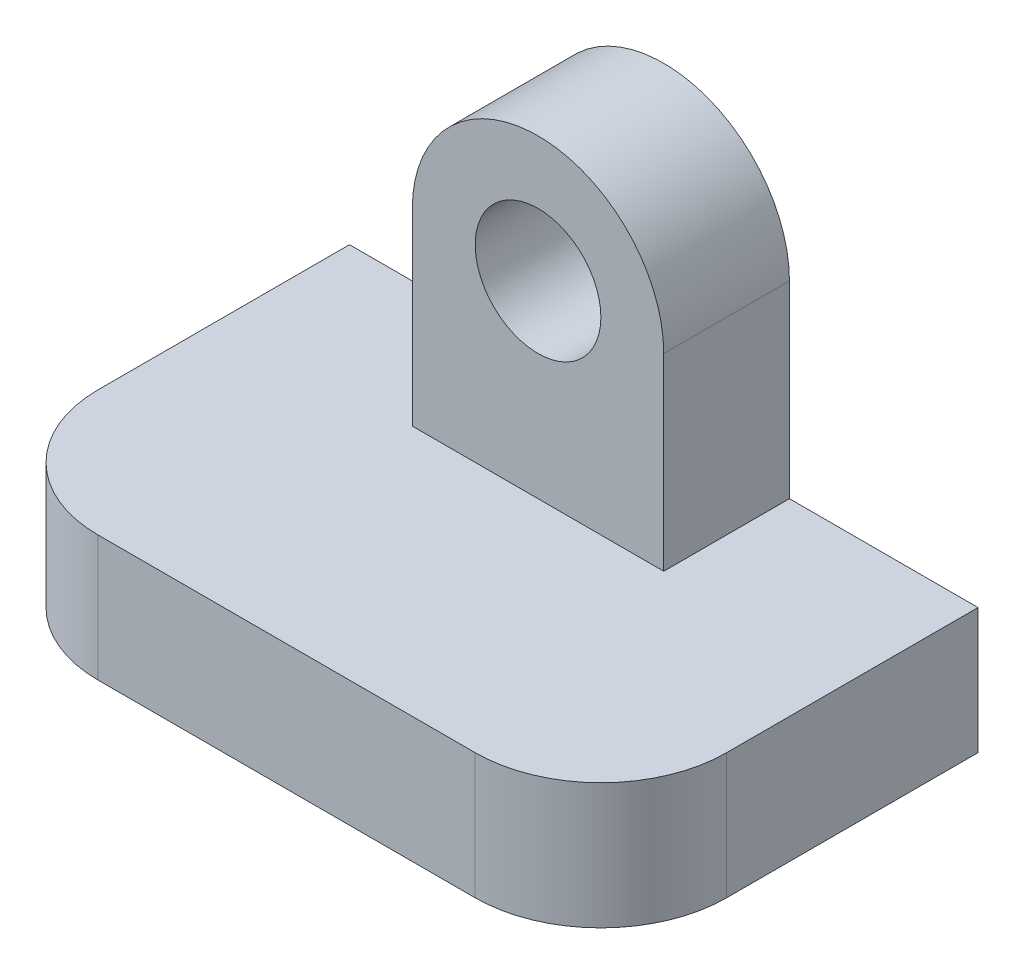
ISO-10303-21;
HEADER;
FILE_DESCRIPTION(('STEP AP214'),'2;1');
FILE_NAME('part.step','',(''),(''),'','','');
FILE_SCHEMA(('AUTOMOTIVE_DESIGN { 1 0 10303 214 1 1 1 1 }'));
ENDSEC;
DATA;
#1=APPLICATION_CONTEXT('core data for automotive mechanical design processes');
#2=APPLICATION_PROTOCOL_DEFINITION('international standard','automotive_design',2000,#1);
#3=PRODUCT_CONTEXT('',#1,'mechanical');
#4=PRODUCT('Part','Part','',(#3));
#5=PRODUCT_RELATED_PRODUCT_CATEGORY('part','',(#4));
#6=PRODUCT_DEFINITION_FORMATION('','',#4);
#7=PRODUCT_DEFINITION_CONTEXT('part definition',#1,'design');
#8=PRODUCT_DEFINITION('design','',#6,#7);
#9=PRODUCT_DEFINITION_SHAPE('','',#8);
#10=(LENGTH_UNIT() NAMED_UNIT(*) SI_UNIT(.MILLI.,.METRE.));
#11=(NAMED_UNIT(*) PLANE_ANGLE_UNIT() SI_UNIT($,.RADIAN.));
#12=(NAMED_UNIT(*) SI_UNIT($,.STERADIAN.) SOLID_ANGLE_UNIT());
#13=UNCERTAINTY_MEASURE_WITH_UNIT(LENGTH_MEASURE(1.E-05),#10,'distance_accuracy_value','');
#14=(GEOMETRIC_REPRESENTATION_CONTEXT(3) GLOBAL_UNCERTAINTY_ASSIGNED_CONTEXT((#13)) GLOBAL_UNIT_ASSIGNED_CONTEXT((#10,
#11,#12)) REPRESENTATION_CONTEXT('',''));
#15=CARTESIAN_POINT('',(0.,0.,0.));
#16=DIRECTION('',(0.,0.,1.));
#17=DIRECTION('',(1.,0.,0.));
#18=AXIS2_PLACEMENT_3D('',#15,#16,#17);
#19=CARTESIAN_POINT('',(0.,10.,0.));
#20=DIRECTION('',(0.,0.,1.));
#21=DIRECTION('',(1.,0.,0.));
#22=AXIS2_PLACEMENT_3D('',#19,#20,#21);
#23=PLANE('',#22);
#24=CARTESIAN_POINT('',(19.9999999989604,25.000009992506,0.));
#25=CARTESIAN_POINT('',(19.9999999994754,25.0000049962539,0.));
#26=CARTESIAN_POINT('',(20.,25.,0.));
#27=CARTESIAN_POINT('',(20.0001044841176,24.0049131740741,0.));
#28=CARTESIAN_POINT('',(20.3806023374436,23.0865828381746,0.));
#29=CARTESIAN_POINT('',(20.7615021102245,22.167282470973,0.));
#30=CARTESIAN_POINT('',(21.4644660940673,21.4644660940673,0.));
#31=CARTESIAN_POINT('',(22.1681726179784,20.7609073330102,0.));
#32=CARTESIAN_POINT('',(23.0865828381746,20.3806023374436,0.));
#33=CARTESIAN_POINT('',(24.0059631740666,19.9998956261324,0.));
#34=CARTESIAN_POINT('',(25.,20.,0.));
#35=CARTESIAN_POINT('',(25.9950868259292,20.0001044841176,0.));
#36=CARTESIAN_POINT('',(26.9134171618254,20.3806023374436,0.));
#37=CARTESIAN_POINT('',(27.8327175290349,20.7615021102292,0.));
#38=CARTESIAN_POINT('',(28.5355339059327,21.4644660940673,0.));
#39=CARTESIAN_POINT('',(29.2390926669922,22.168172617984,0.));
#40=CARTESIAN_POINT('',(29.6193976625564,23.0865828381746,0.));
#41=CARTESIAN_POINT('',(30.,24.0057111184064,0.));
#42=CARTESIAN_POINT('',(30.,25.,0.));
#43=B_SPLINE_CURVE_WITH_KNOTS('',2,(#24,#25,#26,#27,#28,#29,#30,#31,#32,#33,#34,#35,#36,#37,#38,
#39,#40,#41,#42),.UNSPECIFIED.,.F.,.F.,(3,2,2,2,2,2,2,2,2,3),(0.,3.1413913781364E-07,
0.0625003141391378,0.125000314139138,0.187500314139138,0.250000314139138,0.312500314139138,
0.375000314139138,0.437500314139138,0.500000314139138),.UNSPECIFIED.);
#44=CARTESIAN_POINT('',(20.,25.,-0.000249999737606593));
#45=VERTEX_POINT('',#44);
#46=CARTESIAN_POINT('',(30.,25.,-0.000250000000000868));
#47=VERTEX_POINT('',#46);
#48=EDGE_CURVE('E67',#45,#47,#43,.T.);
#49=ORIENTED_EDGE('',*,*,#48,.T.);
#50=CARTESIAN_POINT('',(35.,25.,-0.001));
#51=DIRECTION('',(-1.,0.,0.));
#52=VECTOR('',#51,1.);
#53=LINE('',#50,#52);
#54=CARTESIAN_POINT('',(35.,25.,-0.0005));
#55=VERTEX_POINT('',#54);
#56=EDGE_CURVE('E146',#55,#47,#53,.T.);
#57=ORIENTED_EDGE('',*,*,#56,.F.);
#58=DIRECTION('',(0.,-1.,0.));
#59=VECTOR('',#58,1.);
#60=CARTESIAN_POINT('',(35.,25.,0.));
#61=LINE('',#60,#59);
#62=CARTESIAN_POINT('',(35.,10.,0.));
#63=VERTEX_POINT('',#62);
#64=EDGE_CURVE('E305',#55,#63,#61,.T.);
#65=ORIENTED_EDGE('',*,*,#64,.T.);
#66=DIRECTION('',(-1.,0.,0.));
#67=VECTOR('',#66,1.);
#68=CARTESIAN_POINT('',(0.,10.,0.));
#69=LINE('',#68,#67);
#70=CARTESIAN_POINT('',(50.,10.,0.));
#71=VERTEX_POINT('',#70);
#72=EDGE_CURVE('E272',#71,#63,#69,.T.);
#73=ORIENTED_EDGE('',*,*,#72,.F.);
#74=DIRECTION('',(0.,-1.,0.));
#75=VECTOR('',#74,1.);
#76=CARTESIAN_POINT('',(50.,10.,0.));
#77=LINE('',#76,#75);
#78=CARTESIAN_POINT('',(50.,0.,0.));
#79=VERTEX_POINT('',#78);
#80=EDGE_CURVE('E275',#71,#79,#77,.T.);
#81=ORIENTED_EDGE('',*,*,#80,.T.);
#82=DIRECTION('',(-1.,0.,0.));
#83=VECTOR('',#82,1.);
#84=CARTESIAN_POINT('',(0.,0.,0.));
#85=LINE('',#84,#83);
#86=CARTESIAN_POINT('',(0.,0.,0.));
#87=VERTEX_POINT('',#86);
#88=EDGE_CURVE('E262',#79,#87,#85,.T.);
#89=ORIENTED_EDGE('',*,*,#88,.T.);
#90=DIRECTION('',(0.,-1.,0.));
#91=VECTOR('',#90,1.);
#92=CARTESIAN_POINT('',(0.,10.,0.));
#93=LINE('',#92,#91);
#94=CARTESIAN_POINT('',(0.,10.,0.));
#95=VERTEX_POINT('',#94);
#96=EDGE_CURVE('E268',#95,#87,#93,.T.);
#97=ORIENTED_EDGE('',*,*,#96,.F.);
#98=CARTESIAN_POINT('',(15.,10.,0.));
#99=VERTEX_POINT('',#98);
#100=EDGE_CURVE('E292',#99,#95,#69,.T.);
#101=ORIENTED_EDGE('',*,*,#100,.F.);
#102=DIRECTION('',(0.,-1.,0.));
#103=VECTOR('',#102,1.);
#104=CARTESIAN_POINT('',(15.,25.,0.));
#105=LINE('',#104,#103);
#106=CARTESIAN_POINT('',(15.,25.,-0.0005));
#107=VERTEX_POINT('',#106);
#108=EDGE_CURVE('E306',#107,#99,#105,.T.);
#109=ORIENTED_EDGE('',*,*,#108,.F.);
#110=CARTESIAN_POINT('',(20.,25.,-0.001));
#111=DIRECTION('',(-1.,0.,0.));
#112=VECTOR('',#111,1.);
#113=LINE('',#110,#112);
#114=EDGE_CURVE('E155',#45,#107,#113,.T.);
#115=ORIENTED_EDGE('',*,*,#114,.F.);
#116=EDGE_LOOP('',(#49,#57,#65,#73,#81,#89,#97,#101,#109,#115));
#117=FACE_BOUND('',#116,.T.);
#118=ADVANCED_FACE('F50',(#117),#23,.F.);
#119=CARTESIAN_POINT('',(25.,25.,-0.001));
#120=DIRECTION('',(0.,0.,-1.));
#121=DIRECTION('',(-1.,0.,0.));
#122=AXIS2_PLACEMENT_3D('',#119,#120,#121);
#123=PLANE('',#122);
#124=ORIENTED_EDGE('',*,*,#56,.T.);
#125=CARTESIAN_POINT('',(30.,25.,-0.001));
#126=CARTESIAN_POINT('',(30.,25.9942888815982,-0.001));
#127=CARTESIAN_POINT('',(29.6193976625564,26.9134171618254,-0.001));
#128=CARTESIAN_POINT('',(29.2390926669866,27.8318273820249,-0.001));
#129=CARTESIAN_POINT('',(28.5355339059327,28.5355339059327,-0.001));
#130=CARTESIAN_POINT('',(27.832717529027,29.2384978897755,-0.001));
#131=CARTESIAN_POINT('',(26.9134171618254,29.6193976625564,-0.001));
#132=CARTESIAN_POINT('',(25.9950868259259,29.9998955158824,-0.001));
#133=CARTESIAN_POINT('',(25.,30.,-0.001));
#134=CARTESIAN_POINT('',(24.0059631740619,30.0001043738676,-0.001));
#135=CARTESIAN_POINT('',(23.0865828381746,29.6193976625564,-0.001));
#136=CARTESIAN_POINT('',(22.1681726179751,29.2390926669866,-0.001));
#137=CARTESIAN_POINT('',(21.4644660940673,28.5355339059327,-0.001));
#138=CARTESIAN_POINT('',(20.7615021102245,27.832717529027,-0.001));
#139=CARTESIAN_POINT('',(20.3806023374436,26.9134171618254,-0.001));
#140=CARTESIAN_POINT('',(20.,25.9948346538468,-0.001));
#141=CARTESIAN_POINT('',(20.,25.,-0.001));
#142=B_SPLINE_CURVE_WITH_KNOTS('',2,(#125,#126,#127,#128,#129,#130,#131,#132,#133,#134,#135,
#136,#137,#138,#139,#140,#141),.UNSPECIFIED.,.F.,.F.,(3,2,2,2,2,2,2,2,3),(0.,0.125,0.25,0.375,
0.5,0.625,0.75,0.875,1.),.UNSPECIFIED.);
#143=EDGE_CURVE('E132',#47,#45,#142,.T.);
#144=ORIENTED_EDGE('',*,*,#143,.T.);
#145=ORIENTED_EDGE('',*,*,#114,.T.);
#146=CARTESIAN_POINT('',(25.,25.,-0.001));
#147=DIRECTION('',(0.,0.,-1.));
#148=DIRECTION('',(-1.,0.,0.));
#149=AXIS2_PLACEMENT_3D('',#146,#147,#148);
#150=CIRCLE('',#149,10.);
#151=EDGE_CURVE('E142',#107,#55,#150,.T.);
#152=ORIENTED_EDGE('',*,*,#151,.T.);
#153=EDGE_LOOP('',(#124,#144,#145,#152));
#154=FACE_BOUND('',#153,.T.);
#155=ADVANCED_FACE('F157',(#154),#123,.T.);
#156=CARTESIAN_POINT('',(0.,10.,0.));
#157=DIRECTION('',(1.,0.,0.));
#158=DIRECTION('',(0.,0.,-1.));
#159=AXIS2_PLACEMENT_3D('',#156,#157,#158);
#160=PLANE('',#159);
#161=DIRECTION('',(0.,0.,1.));
#162=VECTOR('',#161,1.);
#163=CARTESIAN_POINT('',(0.,0.,0.));
#164=LINE('',#163,#162);
#165=CARTESIAN_POINT('',(0.,0.,20.));
#166=VERTEX_POINT('',#165);
#167=EDGE_CURVE('E245',#87,#166,#164,.T.);
#168=ORIENTED_EDGE('',*,*,#167,.T.);
#169=DIRECTION('',(0.,-1.,0.));
#170=VECTOR('',#169,1.);
#171=CARTESIAN_POINT('',(0.,10.,20.));
#172=LINE('',#171,#170);
#173=CARTESIAN_POINT('',(0.,10.,20.));
#174=VERTEX_POINT('',#173);
#175=EDGE_CURVE('E11',#174,#166,#172,.T.);
#176=ORIENTED_EDGE('',*,*,#175,.F.);
#177=DIRECTION('',(0.,0.,1.));
#178=VECTOR('',#177,1.);
#179=CARTESIAN_POINT('',(0.,10.,0.));
#180=LINE('',#179,#178);
#181=EDGE_CURVE('E270',#95,#174,#180,.T.);
#182=ORIENTED_EDGE('',*,*,#181,.F.);
#183=ORIENTED_EDGE('',*,*,#96,.T.);
#184=EDGE_LOOP('',(#168,#176,#182,#183));
#185=FACE_BOUND('',#184,.T.);
#186=ADVANCED_FACE('F47',(#185),#160,.F.);
#187=CARTESIAN_POINT('',(10.,10.,20.));
#188=DIRECTION('',(0.,-1.,0.));
#189=DIRECTION('',(0.,0.,-1.));
#190=AXIS2_PLACEMENT_3D('',#187,#188,#189);
#191=CYLINDRICAL_SURFACE('',#190,10.);
#192=CARTESIAN_POINT('',(10.,0.,20.));
#193=DIRECTION('',(0.,1.,0.));
#194=DIRECTION('',(0.,0.,1.));
#195=AXIS2_PLACEMENT_3D('',#192,#193,#194);
#196=CIRCLE('',#195,10.);
#197=CARTESIAN_POINT('',(10.,0.,30.));
#198=VERTEX_POINT('',#197);
#199=EDGE_CURVE('E234',#166,#198,#196,.T.);
#200=ORIENTED_EDGE('',*,*,#199,.T.);
#201=DIRECTION('',(0.,-1.,0.));
#202=VECTOR('',#201,1.);
#203=CARTESIAN_POINT('',(10.,10.,30.));
#204=LINE('',#203,#202);
#205=CARTESIAN_POINT('',(10.,10.,30.));
#206=VERTEX_POINT('',#205);
#207=EDGE_CURVE('E56',#206,#198,#204,.T.);
#208=ORIENTED_EDGE('',*,*,#207,.F.);
#209=CARTESIAN_POINT('',(10.,10.,20.));
#210=DIRECTION('',(0.,1.,0.));
#211=DIRECTION('',(0.,0.,1.));
#212=AXIS2_PLACEMENT_3D('',#209,#210,#211);
#213=CIRCLE('',#212,10.);
#214=EDGE_CURVE('E291',#174,#206,#213,.T.);
#215=ORIENTED_EDGE('',*,*,#214,.F.);
#216=ORIENTED_EDGE('',*,*,#175,.T.);
#217=EDGE_LOOP('',(#200,#208,#215,#216));
#218=FACE_BOUND('',#217,.T.);
#219=ADVANCED_FACE('F223',(#218),#191,.T.);
#220=CARTESIAN_POINT('',(10.,10.,30.));
#221=DIRECTION('',(0.,0.,-1.));
#222=DIRECTION('',(-1.,0.,0.));
#223=AXIS2_PLACEMENT_3D('',#220,#221,#222);
#224=PLANE('',#223);
#225=DIRECTION('',(1.,0.,0.));
#226=VECTOR('',#225,1.);
#227=CARTESIAN_POINT('',(10.,0.,30.));
#228=LINE('',#227,#226);
#229=CARTESIAN_POINT('',(40.,0.,30.));
#230=VERTEX_POINT('',#229);
#231=EDGE_CURVE('E242',#198,#230,#228,.T.);
#232=ORIENTED_EDGE('',*,*,#231,.T.);
#233=DIRECTION('',(0.,-1.,0.));
#234=VECTOR('',#233,1.);
#235=CARTESIAN_POINT('',(40.,10.,30.));
#236=LINE('',#235,#234);
#237=CARTESIAN_POINT('',(40.,10.,30.));
#238=VERTEX_POINT('',#237);
#239=EDGE_CURVE('E246',#238,#230,#236,.T.);
#240=ORIENTED_EDGE('',*,*,#239,.F.);
#241=DIRECTION('',(1.,0.,0.));
#242=VECTOR('',#241,1.);
#243=CARTESIAN_POINT('',(10.,10.,30.));
#244=LINE('',#243,#242);
#245=EDGE_CURVE('E248',#206,#238,#244,.T.);
#246=ORIENTED_EDGE('',*,*,#245,.F.);
#247=ORIENTED_EDGE('',*,*,#207,.T.);
#248=EDGE_LOOP('',(#232,#240,#246,#247));
#249=FACE_BOUND('',#248,.T.);
#250=ADVANCED_FACE('F225',(#249),#224,.F.);
#251=CARTESIAN_POINT('',(40.,10.,20.));
#252=DIRECTION('',(0.,-1.,0.));
#253=DIRECTION('',(0.,0.,-1.));
#254=AXIS2_PLACEMENT_3D('',#251,#252,#253);
#255=CYLINDRICAL_SURFACE('',#254,10.);
#256=CARTESIAN_POINT('',(40.,0.,20.));
#257=DIRECTION('',(0.,1.,0.));
#258=DIRECTION('',(0.,0.,1.));
#259=AXIS2_PLACEMENT_3D('',#256,#257,#258);
#260=CIRCLE('',#259,10.);
#261=CARTESIAN_POINT('',(50.,0.,20.));
#262=VERTEX_POINT('',#261);
#263=EDGE_CURVE('E255',#230,#262,#260,.T.);
#264=ORIENTED_EDGE('',*,*,#263,.T.);
#265=DIRECTION('',(0.,-1.,0.));
#266=VECTOR('',#265,1.);
#267=CARTESIAN_POINT('',(50.,10.,20.));
#268=LINE('',#267,#266);
#269=CARTESIAN_POINT('',(50.,10.,20.));
#270=VERTEX_POINT('',#269);
#271=EDGE_CURVE('E280',#270,#262,#268,.T.);
#272=ORIENTED_EDGE('',*,*,#271,.F.);
#273=CARTESIAN_POINT('',(40.,10.,20.));
#274=DIRECTION('',(0.,1.,0.));
#275=DIRECTION('',(0.,0.,1.));
#276=AXIS2_PLACEMENT_3D('',#273,#274,#275);
#277=CIRCLE('',#276,10.);
#278=EDGE_CURVE('E285',#238,#270,#277,.T.);
#279=ORIENTED_EDGE('',*,*,#278,.F.);
#280=ORIENTED_EDGE('',*,*,#239,.T.);
#281=EDGE_LOOP('',(#264,#272,#279,#280));
#282=FACE_BOUND('',#281,.T.);
#283=ADVANCED_FACE('F217',(#282),#255,.T.);
#284=CARTESIAN_POINT('',(50.,10.,0.));
#285=DIRECTION('',(-1.,0.,0.));
#286=DIRECTION('',(0.,0.,1.));
#287=AXIS2_PLACEMENT_3D('',#284,#285,#286);
#288=PLANE('',#287);
#289=DIRECTION('',(0.,0.,-1.));
#290=VECTOR('',#289,1.);
#291=CARTESIAN_POINT('',(50.,0.,0.));
#292=LINE('',#291,#290);
#293=EDGE_CURVE('E256',#262,#79,#292,.T.);
#294=ORIENTED_EDGE('',*,*,#293,.T.);
#295=ORIENTED_EDGE('',*,*,#80,.F.);
#296=DIRECTION('',(0.,0.,-1.));
#297=VECTOR('',#296,1.);
#298=CARTESIAN_POINT('',(50.,10.,0.));
#299=LINE('',#298,#297);
#300=EDGE_CURVE('E290',#270,#71,#299,.T.);
#301=ORIENTED_EDGE('',*,*,#300,.F.);
#302=ORIENTED_EDGE('',*,*,#271,.T.);
#303=EDGE_LOOP('',(#294,#295,#301,#302));
#304=FACE_BOUND('',#303,.T.);
#305=ADVANCED_FACE('F213',(#304),#288,.F.);
#306=CARTESIAN_POINT('',(10.,10.,20.));
#307=DIRECTION('',(0.,1.,0.));
#308=DIRECTION('',(0.,0.,1.));
#309=AXIS2_PLACEMENT_3D('',#306,#307,#308);
#310=PLANE('',#309);
#311=DIRECTION('',(0.,0.,1.));
#312=VECTOR('',#311,1.);
#313=CARTESIAN_POINT('',(15.,10.,0.));
#314=LINE('',#313,#312);
#315=CARTESIAN_POINT('',(15.,10.,10.));
#316=VERTEX_POINT('',#315);
#317=EDGE_CURVE('E326',#99,#316,#314,.T.);
#318=ORIENTED_EDGE('',*,*,#317,.F.);
#319=ORIENTED_EDGE('',*,*,#100,.T.);
#320=ORIENTED_EDGE('',*,*,#181,.T.);
#321=ORIENTED_EDGE('',*,*,#214,.T.);
#322=ORIENTED_EDGE('',*,*,#245,.T.);
#323=ORIENTED_EDGE('',*,*,#278,.T.);
#324=ORIENTED_EDGE('',*,*,#300,.T.);
#325=ORIENTED_EDGE('',*,*,#72,.T.);
#326=DIRECTION('',(0.,0.,-1.));
#327=VECTOR('',#326,1.);
#328=CARTESIAN_POINT('',(35.,10.,0.));
#329=LINE('',#328,#327);
#330=CARTESIAN_POINT('',(35.,10.,10.));
#331=VERTEX_POINT('',#330);
#332=EDGE_CURVE('E323',#331,#63,#329,.T.);
#333=ORIENTED_EDGE('',*,*,#332,.F.);
#334=DIRECTION('',(1.,0.,0.));
#335=VECTOR('',#334,1.);
#336=CARTESIAN_POINT('',(0.,10.,10.));
#337=LINE('',#336,#335);
#338=EDGE_CURVE('E73',#316,#331,#337,.T.);
#339=ORIENTED_EDGE('',*,*,#338,.F.);
#340=EDGE_LOOP('',(#318,#319,#320,#321,#322,#323,#324,#325,#333,#339));
#341=FACE_BOUND('',#340,.T.);
#342=ADVANCED_FACE('F220',(#341),#310,.T.);
#343=CARTESIAN_POINT('',(10.,0.,20.));
#344=DIRECTION('',(0.,1.,0.));
#345=DIRECTION('',(0.,0.,1.));
#346=AXIS2_PLACEMENT_3D('',#343,#344,#345);
#347=PLANE('',#346);
#348=ORIENTED_EDGE('',*,*,#167,.F.);
#349=ORIENTED_EDGE('',*,*,#88,.F.);
#350=ORIENTED_EDGE('',*,*,#293,.F.);
#351=ORIENTED_EDGE('',*,*,#263,.F.);
#352=ORIENTED_EDGE('',*,*,#231,.F.);
#353=ORIENTED_EDGE('',*,*,#199,.F.);
#354=EDGE_LOOP('',(#348,#349,#350,#351,#352,#353));
#355=FACE_BOUND('',#354,.T.);
#356=ADVANCED_FACE('F211',(#355),#347,.F.);
#357=CARTESIAN_POINT('',(0.,25.,10.));
#358=DIRECTION('',(0.,0.,-1.));
#359=DIRECTION('',(-1.,0.,0.));
#360=AXIS2_PLACEMENT_3D('',#357,#358,#359);
#361=PLANE('',#360);
#362=CARTESIAN_POINT('',(25.,25.,10.));
#363=DIRECTION('',(0.,0.,1.));
#364=DIRECTION('',(1.,0.,0.));
#365=AXIS2_PLACEMENT_3D('',#362,#363,#364);
#366=CIRCLE('',#365,5.);
#367=CARTESIAN_POINT('',(30.,25.,10.));
#368=VERTEX_POINT('',#367);
#369=EDGE_CURVE('E154',#368,#368,#366,.T.);
#370=ORIENTED_EDGE('',*,*,#369,.F.);
#371=EDGE_LOOP('',(#370));
#372=FACE_BOUND('',#371,.T.);
#373=DIRECTION('',(0.,-1.,0.));
#374=VECTOR('',#373,1.);
#375=CARTESIAN_POINT('',(35.,25.,10.));
#376=LINE('',#375,#374);
#377=CARTESIAN_POINT('',(35.,25.,10.));
#378=VERTEX_POINT('',#377);
#379=EDGE_CURVE('E300',#378,#331,#376,.T.);
#380=ORIENTED_EDGE('',*,*,#379,.F.);
#381=CARTESIAN_POINT('',(25.,25.,10.));
#382=DIRECTION('',(0.,0.,-1.));
#383=DIRECTION('',(-1.,0.,0.));
#384=AXIS2_PLACEMENT_3D('',#381,#382,#383);
#385=CIRCLE('',#384,10.);
#386=CARTESIAN_POINT('',(15.,25.,10.));
#387=VERTEX_POINT('',#386);
#388=EDGE_CURVE('E328',#387,#378,#385,.T.);
#389=ORIENTED_EDGE('',*,*,#388,.F.);
#390=DIRECTION('',(0.,-1.,0.));
#391=VECTOR('',#390,1.);
#392=CARTESIAN_POINT('',(15.,25.,10.));
#393=LINE('',#392,#391);
#394=EDGE_CURVE('E315',#387,#316,#393,.T.);
#395=ORIENTED_EDGE('',*,*,#394,.T.);
#396=ORIENTED_EDGE('',*,*,#338,.T.);
#397=EDGE_LOOP('',(#380,#389,#395,#396));
#398=FACE_BOUND('',#397,.T.);
#399=ADVANCED_FACE('F353',(#372,#398),#361,.F.);
#400=CARTESIAN_POINT('',(35.,25.,0.));
#401=DIRECTION('',(-1.,0.,0.));
#402=DIRECTION('',(0.,0.,1.));
#403=AXIS2_PLACEMENT_3D('',#400,#401,#402);
#404=PLANE('',#403);
#405=ORIENTED_EDGE('',*,*,#332,.T.);
#406=ORIENTED_EDGE('',*,*,#64,.F.);
#407=DIRECTION('',(0.,0.,-1.));
#408=VECTOR('',#407,1.);
#409=CARTESIAN_POINT('',(35.,25.,0.));
#410=LINE('',#409,#408);
#411=EDGE_CURVE('E200',#378,#55,#410,.T.);
#412=ORIENTED_EDGE('',*,*,#411,.F.);
#413=ORIENTED_EDGE('',*,*,#379,.T.);
#414=EDGE_LOOP('',(#405,#406,#412,#413));
#415=FACE_BOUND('',#414,.T.);
#416=ADVANCED_FACE('F322',(#415),#404,.F.);
#417=CARTESIAN_POINT('',(15.,25.,0.));
#418=DIRECTION('',(1.,0.,0.));
#419=DIRECTION('',(0.,0.,-1.));
#420=AXIS2_PLACEMENT_3D('',#417,#418,#419);
#421=PLANE('',#420);
#422=ORIENTED_EDGE('',*,*,#317,.T.);
#423=ORIENTED_EDGE('',*,*,#394,.F.);
#424=DIRECTION('',(0.,0.,1.));
#425=VECTOR('',#424,1.);
#426=CARTESIAN_POINT('',(15.,25.,0.));
#427=LINE('',#426,#425);
#428=EDGE_CURVE('E165',#107,#387,#427,.T.);
#429=ORIENTED_EDGE('',*,*,#428,.F.);
#430=ORIENTED_EDGE('',*,*,#108,.T.);
#431=EDGE_LOOP('',(#422,#423,#429,#430));
#432=FACE_BOUND('',#431,.T.);
#433=ADVANCED_FACE('F366',(#432),#421,.F.);
#434=CARTESIAN_POINT('',(25.,25.,10.));
#435=DIRECTION('',(0.,0.,-1.));
#436=DIRECTION('',(-1.,0.,0.));
#437=AXIS2_PLACEMENT_3D('',#434,#435,#436);
#438=CYLINDRICAL_SURFACE('',#437,10.);
#439=ORIENTED_EDGE('',*,*,#388,.T.);
#440=ORIENTED_EDGE('',*,*,#411,.T.);
#441=ORIENTED_EDGE('',*,*,#151,.F.);
#442=ORIENTED_EDGE('',*,*,#428,.T.);
#443=EDGE_LOOP('',(#439,#440,#441,#442));
#444=FACE_BOUND('',#443,.T.);
#445=ADVANCED_FACE('F181',(#444),#438,.T.);
#446=CARTESIAN_POINT('',(25.,25.,0.));
#447=DIRECTION('',(0.,0.,1.));
#448=DIRECTION('',(1.,0.,0.));
#449=AXIS2_PLACEMENT_3D('',#446,#447,#448);
#450=CYLINDRICAL_SURFACE('',#449,5.);
#451=ORIENTED_EDGE('',*,*,#143,.F.);
#452=ORIENTED_EDGE('',*,*,#48,.F.);
#453=EDGE_LOOP('',(#451,#452));
#454=FACE_BOUND('',#453,.T.);
#455=ORIENTED_EDGE('',*,*,#369,.T.);
#456=EDGE_LOOP('',(#455));
#457=FACE_BOUND('',#456,.T.);
#458=ADVANCED_FACE('F131',(#454,#457),#450,.F.);
#459=CLOSED_SHELL('',(#118,#155,#186,#219,#250,#283,#305,#342,#356,#399,#416,#433,#445,#458));
#460=MANIFOLD_SOLID_BREP('B2',#459);
#461=ADVANCED_BREP_SHAPE_REPRESENTATION('',(#18,#460),#14);
#462=SHAPE_DEFINITION_REPRESENTATION(#9,#461);
ENDSEC;
END-ISO-10303-21;
